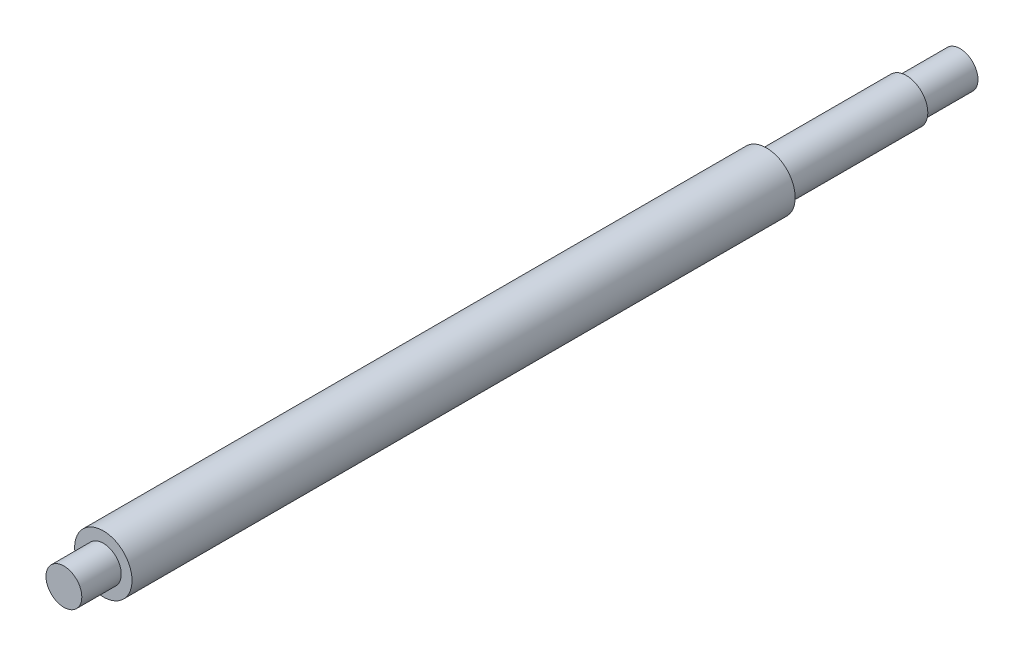
ISO-10303-21;
HEADER;
FILE_DESCRIPTION(('STEP AP214'),'2;1');
FILE_NAME('part.step','',(''),(''),'','','');
FILE_SCHEMA(('AUTOMOTIVE_DESIGN { 1 0 10303 214 1 1 1 1 }'));
ENDSEC;
DATA;
#1=APPLICATION_CONTEXT('core data for automotive mechanical design processes');
#2=APPLICATION_PROTOCOL_DEFINITION('international standard','automotive_design',2000,#1);
#3=PRODUCT_CONTEXT('',#1,'mechanical');
#4=PRODUCT('Part','Part','',(#3));
#5=PRODUCT_RELATED_PRODUCT_CATEGORY('part','',(#4));
#6=PRODUCT_DEFINITION_FORMATION('','',#4);
#7=PRODUCT_DEFINITION_CONTEXT('part definition',#1,'design');
#8=PRODUCT_DEFINITION('design','',#6,#7);
#9=PRODUCT_DEFINITION_SHAPE('','',#8);
#10=(LENGTH_UNIT() NAMED_UNIT(*) SI_UNIT(.MILLI.,.METRE.));
#11=(NAMED_UNIT(*) PLANE_ANGLE_UNIT() SI_UNIT($,.RADIAN.));
#12=(NAMED_UNIT(*) SI_UNIT($,.STERADIAN.) SOLID_ANGLE_UNIT());
#13=UNCERTAINTY_MEASURE_WITH_UNIT(LENGTH_MEASURE(1.E-05),#10,'distance_accuracy_value','');
#14=(GEOMETRIC_REPRESENTATION_CONTEXT(3) GLOBAL_UNCERTAINTY_ASSIGNED_CONTEXT((#13)) GLOBAL_UNIT_ASSIGNED_CONTEXT((#10,
#11,#12)) REPRESENTATION_CONTEXT('',''));
#15=CARTESIAN_POINT('',(0.,0.,0.));
#16=DIRECTION('',(0.,0.,1.));
#17=DIRECTION('',(1.,0.,0.));
#18=AXIS2_PLACEMENT_3D('',#15,#16,#17);
#19=CARTESIAN_POINT('',(0.,0.,15.));
#20=DIRECTION('',(0.,0.,-1.));
#21=DIRECTION('',(-1.,0.,0.));
#22=AXIS2_PLACEMENT_3D('',#19,#20,#21);
#23=CYLINDRICAL_SURFACE('',#22,5.);
#24=CARTESIAN_POINT('',(0.,0.,15.));
#25=DIRECTION('',(0.,0.,1.));
#26=DIRECTION('',(1.,0.,0.));
#27=AXIS2_PLACEMENT_3D('',#24,#25,#26);
#28=CIRCLE('',#27,5.);
#29=CARTESIAN_POINT('',(5.,0.,15.));
#30=VERTEX_POINT('',#29);
#31=EDGE_CURVE('E41',#30,#30,#28,.T.);
#32=ORIENTED_EDGE('',*,*,#31,.F.);
#33=EDGE_LOOP('',(#32));
#34=FACE_BOUND('',#33,.T.);
#35=CARTESIAN_POINT('',(0.,0.,0.));
#36=DIRECTION('',(0.,0.,1.));
#37=DIRECTION('',(1.,0.,0.));
#38=AXIS2_PLACEMENT_3D('',#35,#36,#37);
#39=CIRCLE('',#38,5.);
#40=CARTESIAN_POINT('',(5.,0.,0.));
#41=VERTEX_POINT('',#40);
#42=EDGE_CURVE('E37',#41,#41,#39,.T.);
#43=ORIENTED_EDGE('',*,*,#42,.T.);
#44=EDGE_LOOP('',(#43));
#45=FACE_BOUND('',#44,.T.);
#46=ADVANCED_FACE('F34',(#34,#45),#23,.T.);
#47=CARTESIAN_POINT('',(0.,0.,0.));
#48=DIRECTION('',(0.,0.,1.));
#49=DIRECTION('',(1.,0.,0.));
#50=AXIS2_PLACEMENT_3D('',#47,#48,#49);
#51=PLANE('',#50);
#52=ORIENTED_EDGE('',*,*,#42,.F.);
#53=EDGE_LOOP('',(#52));
#54=FACE_BOUND('',#53,.T.);
#55=ADVANCED_FACE('F76',(#54),#51,.F.);
#56=CARTESIAN_POINT('',(0.,0.,54.));
#57=DIRECTION('',(0.,0.,-1.));
#58=DIRECTION('',(-1.,0.,0.));
#59=AXIS2_PLACEMENT_3D('',#56,#57,#58);
#60=CYLINDRICAL_SURFACE('',#59,6.);
#61=CARTESIAN_POINT('',(0.,0.,54.));
#62=DIRECTION('',(0.,0.,1.));
#63=DIRECTION('',(1.,0.,0.));
#64=AXIS2_PLACEMENT_3D('',#61,#62,#63);
#65=CIRCLE('',#64,6.);
#66=CARTESIAN_POINT('',(6.,0.,54.));
#67=VERTEX_POINT('',#66);
#68=EDGE_CURVE('E56',#67,#67,#65,.T.);
#69=ORIENTED_EDGE('',*,*,#68,.F.);
#70=EDGE_LOOP('',(#69));
#71=FACE_BOUND('',#70,.T.);
#72=CARTESIAN_POINT('',(0.,0.,15.));
#73=DIRECTION('',(0.,0.,1.));
#74=DIRECTION('',(1.,0.,0.));
#75=AXIS2_PLACEMENT_3D('',#72,#73,#74);
#76=CIRCLE('',#75,6.);
#77=CARTESIAN_POINT('',(6.,0.,15.));
#78=VERTEX_POINT('',#77);
#79=EDGE_CURVE('E52',#78,#78,#76,.T.);
#80=ORIENTED_EDGE('',*,*,#79,.T.);
#81=EDGE_LOOP('',(#80));
#82=FACE_BOUND('',#81,.T.);
#83=ADVANCED_FACE('F62',(#71,#82),#60,.T.);
#84=CARTESIAN_POINT('',(0.,0.,15.));
#85=DIRECTION('',(0.,0.,1.));
#86=DIRECTION('',(1.,0.,0.));
#87=AXIS2_PLACEMENT_3D('',#84,#85,#86);
#88=PLANE('',#87);
#89=ORIENTED_EDGE('',*,*,#31,.T.);
#90=EDGE_LOOP('',(#89));
#91=FACE_BOUND('',#90,.T.);
#92=ORIENTED_EDGE('',*,*,#79,.F.);
#93=EDGE_LOOP('',(#92));
#94=FACE_BOUND('',#93,.T.);
#95=ADVANCED_FACE('F64',(#91,#94),#88,.F.);
#96=CARTESIAN_POINT('',(0.,0.,239.));
#97=DIRECTION('',(0.,0.,-1.));
#98=DIRECTION('',(-1.,0.,0.));
#99=AXIS2_PLACEMENT_3D('',#96,#97,#98);
#100=CYLINDRICAL_SURFACE('',#99,8.);
#101=CARTESIAN_POINT('',(0.,0.,239.));
#102=DIRECTION('',(0.,0.,1.));
#103=DIRECTION('',(1.,0.,0.));
#104=AXIS2_PLACEMENT_3D('',#101,#102,#103);
#105=CIRCLE('',#104,8.);
#106=CARTESIAN_POINT('',(8.,0.,239.));
#107=VERTEX_POINT('',#106);
#108=EDGE_CURVE('E49',#107,#107,#105,.T.);
#109=ORIENTED_EDGE('',*,*,#108,.F.);
#110=EDGE_LOOP('',(#109));
#111=FACE_BOUND('',#110,.T.);
#112=CARTESIAN_POINT('',(0.,0.,54.));
#113=DIRECTION('',(0.,0.,1.));
#114=DIRECTION('',(1.,0.,0.));
#115=AXIS2_PLACEMENT_3D('',#112,#113,#114);
#116=CIRCLE('',#115,8.);
#117=CARTESIAN_POINT('',(8.,0.,54.));
#118=VERTEX_POINT('',#117);
#119=EDGE_CURVE('E53',#118,#118,#116,.T.);
#120=ORIENTED_EDGE('',*,*,#119,.T.);
#121=EDGE_LOOP('',(#120));
#122=FACE_BOUND('',#121,.T.);
#123=ADVANCED_FACE('F66',(#111,#122),#100,.T.);
#124=CARTESIAN_POINT('',(0.,0.,239.));
#125=DIRECTION('',(0.,0.,1.));
#126=DIRECTION('',(1.,0.,0.));
#127=AXIS2_PLACEMENT_3D('',#124,#125,#126);
#128=PLANE('',#127);
#129=CARTESIAN_POINT('',(0.,0.,239.));
#130=DIRECTION('',(0.,0.,1.));
#131=DIRECTION('',(1.,0.,0.));
#132=AXIS2_PLACEMENT_3D('',#129,#130,#131);
#133=CIRCLE('',#132,5.);
#134=CARTESIAN_POINT('',(5.,0.,239.));
#135=VERTEX_POINT('',#134);
#136=EDGE_CURVE('E10',#135,#135,#133,.T.);
#137=ORIENTED_EDGE('',*,*,#136,.F.);
#138=EDGE_LOOP('',(#137));
#139=FACE_BOUND('',#138,.T.);
#140=ORIENTED_EDGE('',*,*,#108,.T.);
#141=EDGE_LOOP('',(#140));
#142=FACE_BOUND('',#141,.T.);
#143=ADVANCED_FACE('F73',(#139,#142),#128,.T.);
#144=CARTESIAN_POINT('',(0.,0.,54.));
#145=DIRECTION('',(0.,0.,1.));
#146=DIRECTION('',(1.,0.,0.));
#147=AXIS2_PLACEMENT_3D('',#144,#145,#146);
#148=PLANE('',#147);
#149=ORIENTED_EDGE('',*,*,#68,.T.);
#150=EDGE_LOOP('',(#149));
#151=FACE_BOUND('',#150,.T.);
#152=ORIENTED_EDGE('',*,*,#119,.F.);
#153=EDGE_LOOP('',(#152));
#154=FACE_BOUND('',#153,.T.);
#155=ADVANCED_FACE('F112',(#151,#154),#148,.F.);
#156=CARTESIAN_POINT('',(0.,0.,250.));
#157=DIRECTION('',(0.,0.,-1.));
#158=DIRECTION('',(-1.,0.,0.));
#159=AXIS2_PLACEMENT_3D('',#156,#157,#158);
#160=CYLINDRICAL_SURFACE('',#159,5.);
#161=CARTESIAN_POINT('',(0.,0.,250.));
#162=DIRECTION('',(0.,0.,1.));
#163=DIRECTION('',(1.,0.,0.));
#164=AXIS2_PLACEMENT_3D('',#161,#162,#163);
#165=CIRCLE('',#164,5.);
#166=CARTESIAN_POINT('',(5.,0.,250.));
#167=VERTEX_POINT('',#166);
#168=EDGE_CURVE('E48',#167,#167,#165,.T.);
#169=ORIENTED_EDGE('',*,*,#168,.F.);
#170=EDGE_LOOP('',(#169));
#171=FACE_BOUND('',#170,.T.);
#172=ORIENTED_EDGE('',*,*,#136,.T.);
#173=EDGE_LOOP('',(#172));
#174=FACE_BOUND('',#173,.T.);
#175=ADVANCED_FACE('F117',(#171,#174),#160,.T.);
#176=CARTESIAN_POINT('',(0.,0.,250.));
#177=DIRECTION('',(0.,0.,1.));
#178=DIRECTION('',(1.,0.,0.));
#179=AXIS2_PLACEMENT_3D('',#176,#177,#178);
#180=PLANE('',#179);
#181=ORIENTED_EDGE('',*,*,#168,.T.);
#182=EDGE_LOOP('',(#181));
#183=FACE_BOUND('',#182,.T.);
#184=ADVANCED_FACE('F134',(#183),#180,.T.);
#185=CLOSED_SHELL('',(#46,#55,#83,#95,#123,#143,#155,#175,#184));
#186=MANIFOLD_SOLID_BREP('B2',#185);
#187=ADVANCED_BREP_SHAPE_REPRESENTATION('',(#18,#186),#14);
#188=SHAPE_DEFINITION_REPRESENTATION(#9,#187);
ENDSEC;
END-ISO-10303-21;
